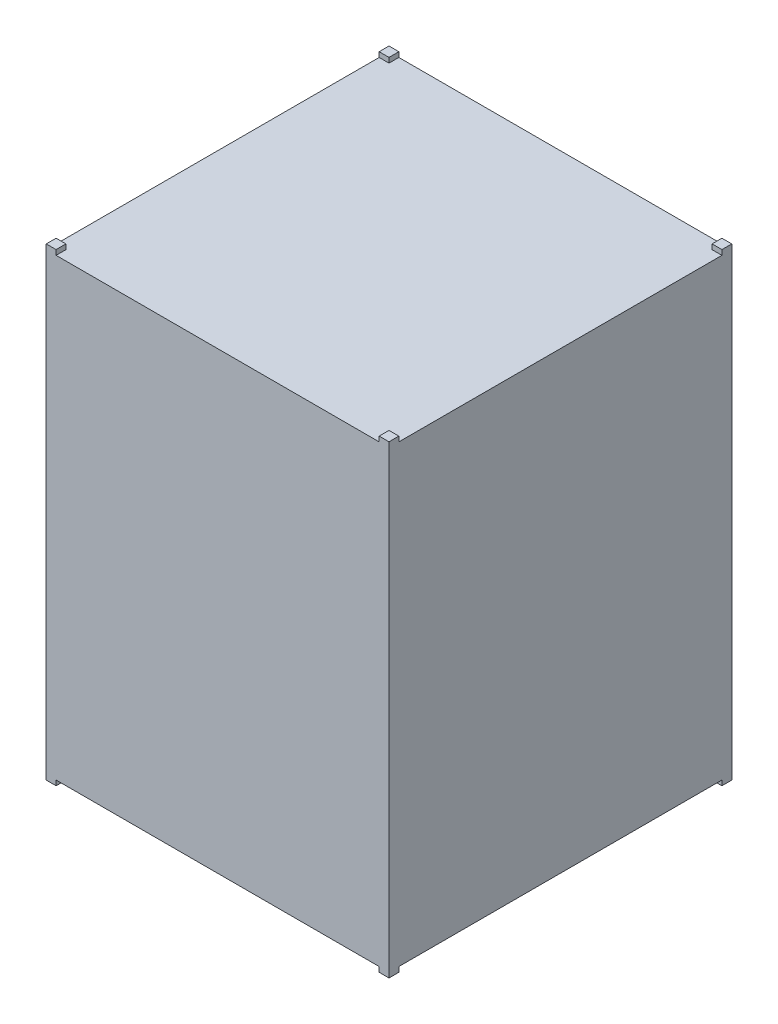
ISO-10303-21;
HEADER;
FILE_DESCRIPTION(('STEP AP214'),'2;1');
FILE_NAME('part.step','',(''),(''),'','','');
FILE_SCHEMA(('AUTOMOTIVE_DESIGN { 1 0 10303 214 1 1 1 1 }'));
ENDSEC;
DATA;
#1=APPLICATION_CONTEXT('core data for automotive mechanical design processes');
#2=APPLICATION_PROTOCOL_DEFINITION('international standard','automotive_design',2000,#1);
#3=PRODUCT_CONTEXT('',#1,'mechanical');
#4=PRODUCT('Part','Part','',(#3));
#5=PRODUCT_RELATED_PRODUCT_CATEGORY('part','',(#4));
#6=PRODUCT_DEFINITION_FORMATION('','',#4);
#7=PRODUCT_DEFINITION_CONTEXT('part definition',#1,'design');
#8=PRODUCT_DEFINITION('design','',#6,#7);
#9=PRODUCT_DEFINITION_SHAPE('','',#8);
#10=(LENGTH_UNIT() NAMED_UNIT(*) SI_UNIT(.MILLI.,.METRE.));
#11=(NAMED_UNIT(*) PLANE_ANGLE_UNIT() SI_UNIT($,.RADIAN.));
#12=(NAMED_UNIT(*) SI_UNIT($,.STERADIAN.) SOLID_ANGLE_UNIT());
#13=UNCERTAINTY_MEASURE_WITH_UNIT(LENGTH_MEASURE(1.E-05),#10,'distance_accuracy_value','');
#14=(GEOMETRIC_REPRESENTATION_CONTEXT(3) GLOBAL_UNCERTAINTY_ASSIGNED_CONTEXT((#13)) GLOBAL_UNIT_ASSIGNED_CONTEXT((#10,
#11,#12)) REPRESENTATION_CONTEXT('',''));
#15=CARTESIAN_POINT('',(0.,0.,0.));
#16=DIRECTION('',(0.,0.,1.));
#17=DIRECTION('',(1.,0.,0.));
#18=AXIS2_PLACEMENT_3D('',#15,#16,#17);
#19=CARTESIAN_POINT('',(-106.65,-150.,-113.15));
#20=DIRECTION('',(0.,0.,-1.));
#21=DIRECTION('',(-1.,0.,0.));
#22=AXIS2_PLACEMENT_3D('',#19,#20,#21);
#23=PLANE('',#22);
#24=DIRECTION('',(-1.,0.,0.));
#25=VECTOR('',#24,1.);
#26=CARTESIAN_POINT('',(-106.65,-150.,-113.15));
#27=LINE('',#26,#25);
#28=CARTESIAN_POINT('',(106.65,-150.,-113.15));
#29=VERTEX_POINT('',#28);
#30=CARTESIAN_POINT('',(-106.65,-150.,-113.15));
#31=VERTEX_POINT('',#30);
#32=EDGE_CURVE('E11',#29,#31,#27,.T.);
#33=ORIENTED_EDGE('',*,*,#32,.T.);
#34=DIRECTION('',(0.,-1.,0.));
#35=VECTOR('',#34,1.);
#36=CARTESIAN_POINT('',(-106.65,153.3,-113.15));
#37=LINE('',#36,#35);
#38=CARTESIAN_POINT('',(-106.65,-153.3,-113.15));
#39=VERTEX_POINT('',#38);
#40=EDGE_CURVE('E263',#31,#39,#37,.T.);
#41=ORIENTED_EDGE('',*,*,#40,.T.);
#42=DIRECTION('',(1.,0.,0.));
#43=VECTOR('',#42,1.);
#44=CARTESIAN_POINT('',(-106.65,-153.3,-113.15));
#45=LINE('',#44,#43);
#46=CARTESIAN_POINT('',(-113.15,-153.3,-113.15));
#47=VERTEX_POINT('',#46);
#48=EDGE_CURVE('E243',#47,#39,#45,.T.);
#49=ORIENTED_EDGE('',*,*,#48,.F.);
#50=DIRECTION('',(0.,-1.,0.));
#51=VECTOR('',#50,1.);
#52=CARTESIAN_POINT('',(-113.15,153.3,-113.15));
#53=LINE('',#52,#51);
#54=CARTESIAN_POINT('',(-113.15,153.3,-113.15));
#55=VERTEX_POINT('',#54);
#56=EDGE_CURVE('E264',#55,#47,#53,.T.);
#57=ORIENTED_EDGE('',*,*,#56,.F.);
#58=DIRECTION('',(1.,0.,0.));
#59=VECTOR('',#58,1.);
#60=CARTESIAN_POINT('',(-106.65,153.3,-113.15));
#61=LINE('',#60,#59);
#62=CARTESIAN_POINT('',(-106.65,153.3,-113.15));
#63=VERTEX_POINT('',#62);
#64=EDGE_CURVE('E228',#55,#63,#61,.T.);
#65=ORIENTED_EDGE('',*,*,#64,.T.);
#66=CARTESIAN_POINT('',(-106.65,150.,-113.15));
#67=VERTEX_POINT('',#66);
#68=EDGE_CURVE('E259',#63,#67,#37,.T.);
#69=ORIENTED_EDGE('',*,*,#68,.T.);
#70=DIRECTION('',(-1.,0.,0.));
#71=VECTOR('',#70,1.);
#72=CARTESIAN_POINT('',(-106.65,150.,-113.15));
#73=LINE('',#72,#71);
#74=CARTESIAN_POINT('',(106.65,150.,-113.15));
#75=VERTEX_POINT('',#74);
#76=EDGE_CURVE('E405',#75,#67,#73,.T.);
#77=ORIENTED_EDGE('',*,*,#76,.F.);
#78=DIRECTION('',(0.,-1.,0.));
#79=VECTOR('',#78,1.);
#80=CARTESIAN_POINT('',(106.65,153.3,-113.15));
#81=LINE('',#80,#79);
#82=CARTESIAN_POINT('',(106.65,153.3,-113.15));
#83=VERTEX_POINT('',#82);
#84=EDGE_CURVE('E301',#83,#75,#81,.T.);
#85=ORIENTED_EDGE('',*,*,#84,.F.);
#86=DIRECTION('',(1.,0.,0.));
#87=VECTOR('',#86,1.);
#88=CARTESIAN_POINT('',(106.65,153.3,-113.15));
#89=LINE('',#88,#87);
#90=CARTESIAN_POINT('',(113.15,153.3,-113.15));
#91=VERTEX_POINT('',#90);
#92=EDGE_CURVE('E283',#83,#91,#89,.T.);
#93=ORIENTED_EDGE('',*,*,#92,.T.);
#94=DIRECTION('',(0.,-1.,0.));
#95=VECTOR('',#94,1.);
#96=CARTESIAN_POINT('',(113.15,153.3,-113.15));
#97=LINE('',#96,#95);
#98=CARTESIAN_POINT('',(113.15,-153.3,-113.15));
#99=VERTEX_POINT('',#98);
#100=EDGE_CURVE('E299',#91,#99,#97,.T.);
#101=ORIENTED_EDGE('',*,*,#100,.T.);
#102=DIRECTION('',(1.,0.,0.));
#103=VECTOR('',#102,1.);
#104=CARTESIAN_POINT('',(106.65,-153.3,-113.15));
#105=LINE('',#104,#103);
#106=CARTESIAN_POINT('',(106.65,-153.3,-113.15));
#107=VERTEX_POINT('',#106);
#108=EDGE_CURVE('E271',#107,#99,#105,.T.);
#109=ORIENTED_EDGE('',*,*,#108,.F.);
#110=EDGE_CURVE('E291',#29,#107,#81,.T.);
#111=ORIENTED_EDGE('',*,*,#110,.F.);
#112=EDGE_LOOP('',(#33,#41,#49,#57,#65,#69,#77,#85,#93,#101,#109,#111));
#113=FACE_BOUND('',#112,.T.);
#114=ADVANCED_FACE('F33',(#113),#23,.T.);
#115=CARTESIAN_POINT('',(113.15,-150.,-106.65));
#116=DIRECTION('',(1.,0.,0.));
#117=DIRECTION('',(0.,0.,-1.));
#118=AXIS2_PLACEMENT_3D('',#115,#116,#117);
#119=PLANE('',#118);
#120=DIRECTION('',(0.,0.,-1.));
#121=VECTOR('',#120,1.);
#122=CARTESIAN_POINT('',(113.15,-150.,-106.65));
#123=LINE('',#122,#121);
#124=CARTESIAN_POINT('',(113.15,-150.,106.65));
#125=VERTEX_POINT('',#124);
#126=CARTESIAN_POINT('',(113.15,-150.,-106.65));
#127=VERTEX_POINT('',#126);
#128=EDGE_CURVE('E425',#125,#127,#123,.T.);
#129=ORIENTED_EDGE('',*,*,#128,.T.);
#130=DIRECTION('',(0.,-1.,0.));
#131=VECTOR('',#130,1.);
#132=CARTESIAN_POINT('',(113.15,153.3,-106.65));
#133=LINE('',#132,#131);
#134=CARTESIAN_POINT('',(113.15,-153.3,-106.65));
#135=VERTEX_POINT('',#134);
#136=EDGE_CURVE('E298',#127,#135,#133,.T.);
#137=ORIENTED_EDGE('',*,*,#136,.T.);
#138=DIRECTION('',(0.,0.,1.));
#139=VECTOR('',#138,1.);
#140=CARTESIAN_POINT('',(113.15,-153.3,-106.65));
#141=LINE('',#140,#139);
#142=EDGE_CURVE('E274',#99,#135,#141,.T.);
#143=ORIENTED_EDGE('',*,*,#142,.F.);
#144=ORIENTED_EDGE('',*,*,#100,.F.);
#145=DIRECTION('',(0.,0.,1.));
#146=VECTOR('',#145,1.);
#147=CARTESIAN_POINT('',(113.15,153.3,-106.65));
#148=LINE('',#147,#146);
#149=CARTESIAN_POINT('',(113.15,153.3,-106.65));
#150=VERTEX_POINT('',#149);
#151=EDGE_CURVE('E286',#91,#150,#148,.T.);
#152=ORIENTED_EDGE('',*,*,#151,.T.);
#153=CARTESIAN_POINT('',(113.15,150.,-106.65));
#154=VERTEX_POINT('',#153);
#155=EDGE_CURVE('E295',#150,#154,#133,.T.);
#156=ORIENTED_EDGE('',*,*,#155,.T.);
#157=DIRECTION('',(0.,0.,-1.));
#158=VECTOR('',#157,1.);
#159=CARTESIAN_POINT('',(113.15,150.,-106.65));
#160=LINE('',#159,#158);
#161=CARTESIAN_POINT('',(113.15,150.,106.65));
#162=VERTEX_POINT('',#161);
#163=EDGE_CURVE('E396',#162,#154,#160,.T.);
#164=ORIENTED_EDGE('',*,*,#163,.F.);
#165=DIRECTION('',(0.,-1.,0.));
#166=VECTOR('',#165,1.);
#167=CARTESIAN_POINT('',(113.15,153.3,106.65));
#168=LINE('',#167,#166);
#169=CARTESIAN_POINT('',(113.15,153.3,106.65));
#170=VERTEX_POINT('',#169);
#171=EDGE_CURVE('E56',#170,#162,#168,.T.);
#172=ORIENTED_EDGE('',*,*,#171,.F.);
#173=DIRECTION('',(0.,0.,1.));
#174=VECTOR('',#173,1.);
#175=CARTESIAN_POINT('',(113.15,153.3,113.15));
#176=LINE('',#175,#174);
#177=CARTESIAN_POINT('',(113.15,153.3,113.15));
#178=VERTEX_POINT('',#177);
#179=EDGE_CURVE('E319',#170,#178,#176,.T.);
#180=ORIENTED_EDGE('',*,*,#179,.T.);
#181=DIRECTION('',(0.,-1.,0.));
#182=VECTOR('',#181,1.);
#183=CARTESIAN_POINT('',(113.15,153.3,113.15));
#184=LINE('',#183,#182);
#185=CARTESIAN_POINT('',(113.15,-153.3,113.15));
#186=VERTEX_POINT('',#185);
#187=EDGE_CURVE('E331',#178,#186,#184,.T.);
#188=ORIENTED_EDGE('',*,*,#187,.T.);
#189=DIRECTION('',(0.,0.,1.));
#190=VECTOR('',#189,1.);
#191=CARTESIAN_POINT('',(113.15,-153.3,113.15));
#192=LINE('',#191,#190);
#193=CARTESIAN_POINT('',(113.15,-153.3,106.65));
#194=VERTEX_POINT('',#193);
#195=EDGE_CURVE('E308',#194,#186,#192,.T.);
#196=ORIENTED_EDGE('',*,*,#195,.F.);
#197=EDGE_CURVE('E334',#125,#194,#168,.T.);
#198=ORIENTED_EDGE('',*,*,#197,.F.);
#199=EDGE_LOOP('',(#129,#137,#143,#144,#152,#156,#164,#172,#180,#188,#196,#198));
#200=FACE_BOUND('',#199,.T.);
#201=ADVANCED_FACE('F465',(#200),#119,.T.);
#202=CARTESIAN_POINT('',(106.65,-150.,113.15));
#203=DIRECTION('',(0.,0.,1.));
#204=DIRECTION('',(1.,0.,0.));
#205=AXIS2_PLACEMENT_3D('',#202,#203,#204);
#206=PLANE('',#205);
#207=DIRECTION('',(1.,0.,0.));
#208=VECTOR('',#207,1.);
#209=CARTESIAN_POINT('',(106.65,-150.,113.15));
#210=LINE('',#209,#208);
#211=CARTESIAN_POINT('',(-106.65,-150.,113.15));
#212=VERTEX_POINT('',#211);
#213=CARTESIAN_POINT('',(106.65,-150.,113.15));
#214=VERTEX_POINT('',#213);
#215=EDGE_CURVE('E418',#212,#214,#210,.T.);
#216=ORIENTED_EDGE('',*,*,#215,.T.);
#217=DIRECTION('',(0.,-1.,0.));
#218=VECTOR('',#217,1.);
#219=CARTESIAN_POINT('',(106.65,153.3,113.15));
#220=LINE('',#219,#218);
#221=CARTESIAN_POINT('',(106.65,-153.3,113.15));
#222=VERTEX_POINT('',#221);
#223=EDGE_CURVE('E330',#214,#222,#220,.T.);
#224=ORIENTED_EDGE('',*,*,#223,.T.);
#225=DIRECTION('',(-1.,0.,0.));
#226=VECTOR('',#225,1.);
#227=CARTESIAN_POINT('',(106.65,-153.3,113.15));
#228=LINE('',#227,#226);
#229=EDGE_CURVE('E311',#186,#222,#228,.T.);
#230=ORIENTED_EDGE('',*,*,#229,.F.);
#231=ORIENTED_EDGE('',*,*,#187,.F.);
#232=DIRECTION('',(-1.,0.,0.));
#233=VECTOR('',#232,1.);
#234=CARTESIAN_POINT('',(106.65,153.3,113.15));
#235=LINE('',#234,#233);
#236=CARTESIAN_POINT('',(106.65,153.3,113.15));
#237=VERTEX_POINT('',#236);
#238=EDGE_CURVE('E322',#178,#237,#235,.T.);
#239=ORIENTED_EDGE('',*,*,#238,.T.);
#240=CARTESIAN_POINT('',(106.65,150.,113.15));
#241=VERTEX_POINT('',#240);
#242=EDGE_CURVE('E326',#237,#241,#220,.T.);
#243=ORIENTED_EDGE('',*,*,#242,.T.);
#244=DIRECTION('',(1.,0.,0.));
#245=VECTOR('',#244,1.);
#246=CARTESIAN_POINT('',(106.65,150.,113.15));
#247=LINE('',#246,#245);
#248=CARTESIAN_POINT('',(-106.65,150.,113.15));
#249=VERTEX_POINT('',#248);
#250=EDGE_CURVE('E388',#249,#241,#247,.T.);
#251=ORIENTED_EDGE('',*,*,#250,.F.);
#252=DIRECTION('',(0.,-1.,0.));
#253=VECTOR('',#252,1.);
#254=CARTESIAN_POINT('',(-106.65,153.3,113.15));
#255=LINE('',#254,#253);
#256=CARTESIAN_POINT('',(-106.65,153.3,113.15));
#257=VERTEX_POINT('',#256);
#258=EDGE_CURVE('E372',#257,#249,#255,.T.);
#259=ORIENTED_EDGE('',*,*,#258,.F.);
#260=DIRECTION('',(-1.,0.,0.));
#261=VECTOR('',#260,1.);
#262=CARTESIAN_POINT('',(-106.65,153.3,113.15));
#263=LINE('',#262,#261);
#264=CARTESIAN_POINT('',(-113.15,153.3,113.15));
#265=VERTEX_POINT('',#264);
#266=EDGE_CURVE('E352',#257,#265,#263,.T.);
#267=ORIENTED_EDGE('',*,*,#266,.T.);
#268=DIRECTION('',(0.,-1.,0.));
#269=VECTOR('',#268,1.);
#270=CARTESIAN_POINT('',(-113.15,153.3,113.15));
#271=LINE('',#270,#269);
#272=CARTESIAN_POINT('',(-113.15,-153.3,113.15));
#273=VERTEX_POINT('',#272);
#274=EDGE_CURVE('E370',#265,#273,#271,.T.);
#275=ORIENTED_EDGE('',*,*,#274,.T.);
#276=DIRECTION('',(-1.,0.,0.));
#277=VECTOR('',#276,1.);
#278=CARTESIAN_POINT('',(-106.65,-153.3,113.15));
#279=LINE('',#278,#277);
#280=CARTESIAN_POINT('',(-106.65,-153.3,113.15));
#281=VERTEX_POINT('',#280);
#282=EDGE_CURVE('E340',#281,#273,#279,.T.);
#283=ORIENTED_EDGE('',*,*,#282,.F.);
#284=EDGE_CURVE('E361',#212,#281,#255,.T.);
#285=ORIENTED_EDGE('',*,*,#284,.F.);
#286=EDGE_LOOP('',(#216,#224,#230,#231,#239,#243,#251,#259,#267,#275,#283,#285));
#287=FACE_BOUND('',#286,.T.);
#288=ADVANCED_FACE('F492',(#287),#206,.T.);
#289=CARTESIAN_POINT('',(-113.15,-150.,-106.65));
#290=DIRECTION('',(-1.,0.,0.));
#291=DIRECTION('',(0.,0.,1.));
#292=AXIS2_PLACEMENT_3D('',#289,#290,#291);
#293=PLANE('',#292);
#294=DIRECTION('',(0.,0.,1.));
#295=VECTOR('',#294,1.);
#296=CARTESIAN_POINT('',(-113.15,-150.,-106.65));
#297=LINE('',#296,#295);
#298=CARTESIAN_POINT('',(-113.15,-150.,-106.65));
#299=VERTEX_POINT('',#298);
#300=CARTESIAN_POINT('',(-113.15,-150.,106.65));
#301=VERTEX_POINT('',#300);
#302=EDGE_CURVE('E411',#299,#301,#297,.T.);
#303=ORIENTED_EDGE('',*,*,#302,.T.);
#304=DIRECTION('',(0.,-1.,0.));
#305=VECTOR('',#304,1.);
#306=CARTESIAN_POINT('',(-113.15,153.3,106.65));
#307=LINE('',#306,#305);
#308=CARTESIAN_POINT('',(-113.15,-153.3,106.65));
#309=VERTEX_POINT('',#308);
#310=EDGE_CURVE('E369',#301,#309,#307,.T.);
#311=ORIENTED_EDGE('',*,*,#310,.T.);
#312=DIRECTION('',(0.,0.,-1.));
#313=VECTOR('',#312,1.);
#314=CARTESIAN_POINT('',(-113.15,-153.3,113.15));
#315=LINE('',#314,#313);
#316=EDGE_CURVE('E343',#273,#309,#315,.T.);
#317=ORIENTED_EDGE('',*,*,#316,.F.);
#318=ORIENTED_EDGE('',*,*,#274,.F.);
#319=DIRECTION('',(0.,0.,-1.));
#320=VECTOR('',#319,1.);
#321=CARTESIAN_POINT('',(-113.15,153.3,113.15));
#322=LINE('',#321,#320);
#323=CARTESIAN_POINT('',(-113.15,153.3,106.65));
#324=VERTEX_POINT('',#323);
#325=EDGE_CURVE('E355',#265,#324,#322,.T.);
#326=ORIENTED_EDGE('',*,*,#325,.T.);
#327=CARTESIAN_POINT('',(-113.15,150.,106.65));
#328=VERTEX_POINT('',#327);
#329=EDGE_CURVE('E366',#324,#328,#307,.T.);
#330=ORIENTED_EDGE('',*,*,#329,.T.);
#331=DIRECTION('',(0.,0.,1.));
#332=VECTOR('',#331,1.);
#333=CARTESIAN_POINT('',(-113.15,150.,-106.65));
#334=LINE('',#333,#332);
#335=CARTESIAN_POINT('',(-113.15,150.,-106.65));
#336=VERTEX_POINT('',#335);
#337=EDGE_CURVE('E379',#336,#328,#334,.T.);
#338=ORIENTED_EDGE('',*,*,#337,.F.);
#339=DIRECTION('',(0.,-1.,0.));
#340=VECTOR('',#339,1.);
#341=CARTESIAN_POINT('',(-113.15,153.3,-106.65));
#342=LINE('',#341,#340);
#343=CARTESIAN_POINT('',(-113.15,153.3,-106.65));
#344=VERTEX_POINT('',#343);
#345=EDGE_CURVE('E266',#344,#336,#342,.T.);
#346=ORIENTED_EDGE('',*,*,#345,.F.);
#347=DIRECTION('',(0.,0.,-1.));
#348=VECTOR('',#347,1.);
#349=CARTESIAN_POINT('',(-113.15,153.3,-106.65));
#350=LINE('',#349,#348);
#351=EDGE_CURVE('E254',#344,#55,#350,.T.);
#352=ORIENTED_EDGE('',*,*,#351,.T.);
#353=ORIENTED_EDGE('',*,*,#56,.T.);
#354=DIRECTION('',(0.,0.,-1.));
#355=VECTOR('',#354,1.);
#356=CARTESIAN_POINT('',(-113.15,-153.3,-106.65));
#357=LINE('',#356,#355);
#358=CARTESIAN_POINT('',(-113.15,-153.3,-106.65));
#359=VERTEX_POINT('',#358);
#360=EDGE_CURVE('E238',#359,#47,#357,.T.);
#361=ORIENTED_EDGE('',*,*,#360,.F.);
#362=EDGE_CURVE('E234',#299,#359,#342,.T.);
#363=ORIENTED_EDGE('',*,*,#362,.F.);
#364=EDGE_LOOP('',(#303,#311,#317,#318,#326,#330,#338,#346,#352,#353,#361,#363));
#365=FACE_BOUND('',#364,.T.);
#366=ADVANCED_FACE('F35',(#365),#293,.T.);
#367=CARTESIAN_POINT('',(0.,-150.,0.));
#368=DIRECTION('',(0.,1.,0.));
#369=DIRECTION('',(0.,0.,1.));
#370=AXIS2_PLACEMENT_3D('',#367,#368,#369);
#371=PLANE('',#370);
#372=DIRECTION('',(0.,0.,1.));
#373=VECTOR('',#372,1.);
#374=CARTESIAN_POINT('',(-106.65,-150.,-113.15));
#375=LINE('',#374,#373);
#376=CARTESIAN_POINT('',(-106.65,-150.,-106.65));
#377=VERTEX_POINT('',#376);
#378=EDGE_CURVE('E224',#31,#377,#375,.T.);
#379=ORIENTED_EDGE('',*,*,#378,.F.);
#380=ORIENTED_EDGE('',*,*,#32,.F.);
#381=DIRECTION('',(0.,0.,-1.));
#382=VECTOR('',#381,1.);
#383=CARTESIAN_POINT('',(106.65,-150.,-113.15));
#384=LINE('',#383,#382);
#385=CARTESIAN_POINT('',(106.65,-150.,-106.65));
#386=VERTEX_POINT('',#385);
#387=EDGE_CURVE('E41',#386,#29,#384,.T.);
#388=ORIENTED_EDGE('',*,*,#387,.F.);
#389=DIRECTION('',(-1.,0.,0.));
#390=VECTOR('',#389,1.);
#391=CARTESIAN_POINT('',(106.65,-150.,-106.65));
#392=LINE('',#391,#390);
#393=EDGE_CURVE('E428',#127,#386,#392,.T.);
#394=ORIENTED_EDGE('',*,*,#393,.F.);
#395=ORIENTED_EDGE('',*,*,#128,.F.);
#396=DIRECTION('',(1.,0.,0.));
#397=VECTOR('',#396,1.);
#398=CARTESIAN_POINT('',(113.15,-150.,106.65));
#399=LINE('',#398,#397);
#400=CARTESIAN_POINT('',(106.65,-150.,106.65));
#401=VERTEX_POINT('',#400);
#402=EDGE_CURVE('E423',#401,#125,#399,.T.);
#403=ORIENTED_EDGE('',*,*,#402,.F.);
#404=DIRECTION('',(0.,0.,-1.));
#405=VECTOR('',#404,1.);
#406=CARTESIAN_POINT('',(106.65,-150.,113.15));
#407=LINE('',#406,#405);
#408=EDGE_CURVE('E421',#214,#401,#407,.T.);
#409=ORIENTED_EDGE('',*,*,#408,.F.);
#410=ORIENTED_EDGE('',*,*,#215,.F.);
#411=DIRECTION('',(0.,0.,1.));
#412=VECTOR('',#411,1.);
#413=CARTESIAN_POINT('',(-106.65,-150.,113.15));
#414=LINE('',#413,#412);
#415=CARTESIAN_POINT('',(-106.65,-150.,106.65));
#416=VERTEX_POINT('',#415);
#417=EDGE_CURVE('E416',#416,#212,#414,.T.);
#418=ORIENTED_EDGE('',*,*,#417,.F.);
#419=DIRECTION('',(1.,0.,0.));
#420=VECTOR('',#419,1.);
#421=CARTESIAN_POINT('',(-113.15,-150.,106.65));
#422=LINE('',#421,#420);
#423=EDGE_CURVE('E414',#301,#416,#422,.T.);
#424=ORIENTED_EDGE('',*,*,#423,.F.);
#425=ORIENTED_EDGE('',*,*,#302,.F.);
#426=DIRECTION('',(-1.,0.,0.));
#427=VECTOR('',#426,1.);
#428=CARTESIAN_POINT('',(-113.15,-150.,-106.65));
#429=LINE('',#428,#427);
#430=EDGE_CURVE('E409',#377,#299,#429,.T.);
#431=ORIENTED_EDGE('',*,*,#430,.F.);
#432=EDGE_LOOP('',(#379,#380,#388,#394,#395,#403,#409,#410,#418,#424,#425,#431));
#433=FACE_BOUND('',#432,.T.);
#434=ADVANCED_FACE('F440',(#433),#371,.F.);
#435=CARTESIAN_POINT('',(0.,150.,0.));
#436=DIRECTION('',(0.,1.,0.));
#437=DIRECTION('',(0.,0.,1.));
#438=AXIS2_PLACEMENT_3D('',#435,#436,#437);
#439=PLANE('',#438);
#440=DIRECTION('',(0.,0.,1.));
#441=VECTOR('',#440,1.);
#442=CARTESIAN_POINT('',(-106.65,150.,-113.15));
#443=LINE('',#442,#441);
#444=CARTESIAN_POINT('',(-106.65,150.,-106.65));
#445=VERTEX_POINT('',#444);
#446=EDGE_CURVE('E364',#67,#445,#443,.T.);
#447=ORIENTED_EDGE('',*,*,#446,.T.);
#448=DIRECTION('',(-1.,0.,0.));
#449=VECTOR('',#448,1.);
#450=CARTESIAN_POINT('',(-113.15,150.,-106.65));
#451=LINE('',#450,#449);
#452=EDGE_CURVE('E376',#445,#336,#451,.T.);
#453=ORIENTED_EDGE('',*,*,#452,.T.);
#454=ORIENTED_EDGE('',*,*,#337,.T.);
#455=DIRECTION('',(1.,0.,0.));
#456=VECTOR('',#455,1.);
#457=CARTESIAN_POINT('',(-113.15,150.,106.65));
#458=LINE('',#457,#456);
#459=CARTESIAN_POINT('',(-106.65,150.,106.65));
#460=VERTEX_POINT('',#459);
#461=EDGE_CURVE('E382',#328,#460,#458,.T.);
#462=ORIENTED_EDGE('',*,*,#461,.T.);
#463=DIRECTION('',(0.,0.,1.));
#464=VECTOR('',#463,1.);
#465=CARTESIAN_POINT('',(-106.65,150.,113.15));
#466=LINE('',#465,#464);
#467=EDGE_CURVE('E385',#460,#249,#466,.T.);
#468=ORIENTED_EDGE('',*,*,#467,.T.);
#469=ORIENTED_EDGE('',*,*,#250,.T.);
#470=DIRECTION('',(0.,0.,-1.));
#471=VECTOR('',#470,1.);
#472=CARTESIAN_POINT('',(106.65,150.,113.15));
#473=LINE('',#472,#471);
#474=CARTESIAN_POINT('',(106.65,150.,106.65));
#475=VERTEX_POINT('',#474);
#476=EDGE_CURVE('E391',#241,#475,#473,.T.);
#477=ORIENTED_EDGE('',*,*,#476,.T.);
#478=DIRECTION('',(1.,0.,0.));
#479=VECTOR('',#478,1.);
#480=CARTESIAN_POINT('',(113.15,150.,106.65));
#481=LINE('',#480,#479);
#482=EDGE_CURVE('E394',#475,#162,#481,.T.);
#483=ORIENTED_EDGE('',*,*,#482,.T.);
#484=ORIENTED_EDGE('',*,*,#163,.T.);
#485=DIRECTION('',(-1.,0.,0.));
#486=VECTOR('',#485,1.);
#487=CARTESIAN_POINT('',(106.65,150.,-106.65));
#488=LINE('',#487,#486);
#489=CARTESIAN_POINT('',(106.65,150.,-106.65));
#490=VERTEX_POINT('',#489);
#491=EDGE_CURVE('E399',#154,#490,#488,.T.);
#492=ORIENTED_EDGE('',*,*,#491,.T.);
#493=DIRECTION('',(0.,0.,-1.));
#494=VECTOR('',#493,1.);
#495=CARTESIAN_POINT('',(106.65,150.,-113.15));
#496=LINE('',#495,#494);
#497=EDGE_CURVE('E402',#490,#75,#496,.T.);
#498=ORIENTED_EDGE('',*,*,#497,.T.);
#499=ORIENTED_EDGE('',*,*,#76,.T.);
#500=EDGE_LOOP('',(#447,#453,#454,#462,#468,#469,#477,#483,#484,#492,#498,#499));
#501=FACE_BOUND('',#500,.T.);
#502=ADVANCED_FACE('F455',(#501),#439,.T.);
#503=CARTESIAN_POINT('',(-106.65,153.3,113.15));
#504=DIRECTION('',(1.,0.,0.));
#505=DIRECTION('',(0.,0.,-1.));
#506=AXIS2_PLACEMENT_3D('',#503,#504,#505);
#507=PLANE('',#506);
#508=ORIENTED_EDGE('',*,*,#417,.T.);
#509=ORIENTED_EDGE('',*,*,#284,.T.);
#510=DIRECTION('',(0.,0.,1.));
#511=VECTOR('',#510,1.);
#512=CARTESIAN_POINT('',(-106.65,-153.3,113.15));
#513=LINE('',#512,#511);
#514=CARTESIAN_POINT('',(-106.65,-153.3,106.65));
#515=VERTEX_POINT('',#514);
#516=EDGE_CURVE('E329',#515,#281,#513,.T.);
#517=ORIENTED_EDGE('',*,*,#516,.F.);
#518=DIRECTION('',(0.,-1.,0.));
#519=VECTOR('',#518,1.);
#520=CARTESIAN_POINT('',(-106.65,153.3,106.65));
#521=LINE('',#520,#519);
#522=EDGE_CURVE('E365',#416,#515,#521,.T.);
#523=ORIENTED_EDGE('',*,*,#522,.F.);
#524=EDGE_LOOP('',(#508,#509,#517,#523));
#525=FACE_BOUND('',#524,.T.);
#526=ADVANCED_FACE('F496',(#525),#507,.T.);
#527=CARTESIAN_POINT('',(-106.65,153.3,106.65));
#528=DIRECTION('',(0.,0.,-1.));
#529=DIRECTION('',(-1.,0.,0.));
#530=AXIS2_PLACEMENT_3D('',#527,#528,#529);
#531=PLANE('',#530);
#532=ORIENTED_EDGE('',*,*,#423,.T.);
#533=ORIENTED_EDGE('',*,*,#522,.T.);
#534=DIRECTION('',(1.,0.,0.));
#535=VECTOR('',#534,1.);
#536=CARTESIAN_POINT('',(-106.65,-153.3,106.65));
#537=LINE('',#536,#535);
#538=EDGE_CURVE('E346',#309,#515,#537,.T.);
#539=ORIENTED_EDGE('',*,*,#538,.F.);
#540=ORIENTED_EDGE('',*,*,#310,.F.);
#541=EDGE_LOOP('',(#532,#533,#539,#540));
#542=FACE_BOUND('',#541,.T.);
#543=ADVANCED_FACE('F499',(#542),#531,.T.);
#544=ORIENTED_EDGE('',*,*,#258,.T.);
#545=ORIENTED_EDGE('',*,*,#467,.F.);
#546=CARTESIAN_POINT('',(-106.65,153.3,106.65));
#547=VERTEX_POINT('',#546);
#548=EDGE_CURVE('E362',#547,#460,#521,.T.);
#549=ORIENTED_EDGE('',*,*,#548,.F.);
#550=DIRECTION('',(0.,0.,1.));
#551=VECTOR('',#550,1.);
#552=CARTESIAN_POINT('',(-106.65,153.3,113.15));
#553=LINE('',#552,#551);
#554=EDGE_CURVE('E349',#547,#257,#553,.T.);
#555=ORIENTED_EDGE('',*,*,#554,.T.);
#556=EDGE_LOOP('',(#544,#545,#549,#555));
#557=FACE_BOUND('',#556,.T.);
#558=ADVANCED_FACE('F538',(#557),#507,.T.);
#559=ORIENTED_EDGE('',*,*,#548,.T.);
#560=ORIENTED_EDGE('',*,*,#461,.F.);
#561=ORIENTED_EDGE('',*,*,#329,.F.);
#562=DIRECTION('',(1.,0.,0.));
#563=VECTOR('',#562,1.);
#564=CARTESIAN_POINT('',(-106.65,153.3,106.65));
#565=LINE('',#564,#563);
#566=EDGE_CURVE('E358',#324,#547,#565,.T.);
#567=ORIENTED_EDGE('',*,*,#566,.T.);
#568=EDGE_LOOP('',(#559,#560,#561,#567));
#569=FACE_BOUND('',#568,.T.);
#570=ADVANCED_FACE('F513',(#569),#531,.T.);
#571=CARTESIAN_POINT('',(0.,153.3,0.));
#572=DIRECTION('',(0.,1.,0.));
#573=DIRECTION('',(0.,0.,1.));
#574=AXIS2_PLACEMENT_3D('',#571,#572,#573);
#575=PLANE('',#574);
#576=ORIENTED_EDGE('',*,*,#554,.F.);
#577=ORIENTED_EDGE('',*,*,#566,.F.);
#578=ORIENTED_EDGE('',*,*,#325,.F.);
#579=ORIENTED_EDGE('',*,*,#266,.F.);
#580=EDGE_LOOP('',(#576,#577,#578,#579));
#581=FACE_BOUND('',#580,.T.);
#582=ADVANCED_FACE('F505',(#581),#575,.T.);
#583=CARTESIAN_POINT('',(0.,-153.3,0.));
#584=DIRECTION('',(0.,1.,0.));
#585=DIRECTION('',(0.,0.,1.));
#586=AXIS2_PLACEMENT_3D('',#583,#584,#585);
#587=PLANE('',#586);
#588=ORIENTED_EDGE('',*,*,#516,.T.);
#589=ORIENTED_EDGE('',*,*,#282,.T.);
#590=ORIENTED_EDGE('',*,*,#316,.T.);
#591=ORIENTED_EDGE('',*,*,#538,.T.);
#592=EDGE_LOOP('',(#588,#589,#590,#591));
#593=FACE_BOUND('',#592,.T.);
#594=ADVANCED_FACE('F503',(#593),#587,.F.);
#595=CARTESIAN_POINT('',(106.65,153.3,113.15));
#596=DIRECTION('',(-1.,0.,0.));
#597=DIRECTION('',(0.,0.,1.));
#598=AXIS2_PLACEMENT_3D('',#595,#596,#597);
#599=PLANE('',#598);
#600=ORIENTED_EDGE('',*,*,#408,.T.);
#601=DIRECTION('',(0.,-1.,0.));
#602=VECTOR('',#601,1.);
#603=CARTESIAN_POINT('',(106.65,153.3,106.65));
#604=LINE('',#603,#602);
#605=CARTESIAN_POINT('',(106.65,-153.3,106.65));
#606=VERTEX_POINT('',#605);
#607=EDGE_CURVE('E325',#401,#606,#604,.T.);
#608=ORIENTED_EDGE('',*,*,#607,.T.);
#609=DIRECTION('',(0.,0.,-1.));
#610=VECTOR('',#609,1.);
#611=CARTESIAN_POINT('',(106.65,-153.3,113.15));
#612=LINE('',#611,#610);
#613=EDGE_CURVE('E293',#222,#606,#612,.T.);
#614=ORIENTED_EDGE('',*,*,#613,.F.);
#615=ORIENTED_EDGE('',*,*,#223,.F.);
#616=EDGE_LOOP('',(#600,#608,#614,#615));
#617=FACE_BOUND('',#616,.T.);
#618=ADVANCED_FACE('F486',(#617),#599,.T.);
#619=CARTESIAN_POINT('',(106.65,153.3,106.65));
#620=DIRECTION('',(0.,0.,-1.));
#621=DIRECTION('',(-1.,0.,0.));
#622=AXIS2_PLACEMENT_3D('',#619,#620,#621);
#623=PLANE('',#622);
#624=ORIENTED_EDGE('',*,*,#402,.T.);
#625=ORIENTED_EDGE('',*,*,#197,.T.);
#626=DIRECTION('',(1.,0.,0.));
#627=VECTOR('',#626,1.);
#628=CARTESIAN_POINT('',(106.65,-153.3,106.65));
#629=LINE('',#628,#627);
#630=EDGE_CURVE('E305',#606,#194,#629,.T.);
#631=ORIENTED_EDGE('',*,*,#630,.F.);
#632=ORIENTED_EDGE('',*,*,#607,.F.);
#633=EDGE_LOOP('',(#624,#625,#631,#632));
#634=FACE_BOUND('',#633,.T.);
#635=ADVANCED_FACE('F479',(#634),#623,.T.);
#636=CARTESIAN_POINT('',(106.65,153.3,106.65));
#637=VERTEX_POINT('',#636);
#638=EDGE_CURVE('E335',#637,#475,#604,.T.);
#639=ORIENTED_EDGE('',*,*,#638,.T.);
#640=ORIENTED_EDGE('',*,*,#476,.F.);
#641=ORIENTED_EDGE('',*,*,#242,.F.);
#642=DIRECTION('',(0.,0.,-1.));
#643=VECTOR('',#642,1.);
#644=CARTESIAN_POINT('',(106.65,153.3,113.15));
#645=LINE('',#644,#643);
#646=EDGE_CURVE('E314',#237,#637,#645,.T.);
#647=ORIENTED_EDGE('',*,*,#646,.T.);
#648=EDGE_LOOP('',(#639,#640,#641,#647));
#649=FACE_BOUND('',#648,.T.);
#650=ADVANCED_FACE('F512',(#649),#599,.T.);
#651=ORIENTED_EDGE('',*,*,#171,.T.);
#652=ORIENTED_EDGE('',*,*,#482,.F.);
#653=ORIENTED_EDGE('',*,*,#638,.F.);
#654=DIRECTION('',(1.,0.,0.));
#655=VECTOR('',#654,1.);
#656=CARTESIAN_POINT('',(106.65,153.3,106.65));
#657=LINE('',#656,#655);
#658=EDGE_CURVE('E317',#637,#170,#657,.T.);
#659=ORIENTED_EDGE('',*,*,#658,.T.);
#660=EDGE_LOOP('',(#651,#652,#653,#659));
#661=FACE_BOUND('',#660,.T.);
#662=ADVANCED_FACE('F585',(#661),#623,.T.);
#663=CARTESIAN_POINT('',(0.,153.3,0.));
#664=DIRECTION('',(0.,-1.,0.));
#665=DIRECTION('',(0.,0.,-1.));
#666=AXIS2_PLACEMENT_3D('',#663,#664,#665);
#667=PLANE('',#666);
#668=ORIENTED_EDGE('',*,*,#646,.F.);
#669=ORIENTED_EDGE('',*,*,#238,.F.);
#670=ORIENTED_EDGE('',*,*,#179,.F.);
#671=ORIENTED_EDGE('',*,*,#658,.F.);
#672=EDGE_LOOP('',(#668,#669,#670,#671));
#673=FACE_BOUND('',#672,.T.);
#674=ADVANCED_FACE('F601',(#673),#667,.F.);
#675=CARTESIAN_POINT('',(0.,-153.3,0.));
#676=DIRECTION('',(0.,-1.,0.));
#677=DIRECTION('',(0.,0.,-1.));
#678=AXIS2_PLACEMENT_3D('',#675,#676,#677);
#679=PLANE('',#678);
#680=ORIENTED_EDGE('',*,*,#613,.T.);
#681=ORIENTED_EDGE('',*,*,#630,.T.);
#682=ORIENTED_EDGE('',*,*,#195,.T.);
#683=ORIENTED_EDGE('',*,*,#229,.T.);
#684=EDGE_LOOP('',(#680,#681,#682,#683));
#685=FACE_BOUND('',#684,.T.);
#686=ADVANCED_FACE('F482',(#685),#679,.T.);
#687=CARTESIAN_POINT('',(106.65,153.3,-106.65));
#688=DIRECTION('',(-1.,0.,0.));
#689=DIRECTION('',(0.,0.,1.));
#690=AXIS2_PLACEMENT_3D('',#687,#688,#689);
#691=PLANE('',#690);
#692=ORIENTED_EDGE('',*,*,#387,.T.);
#693=ORIENTED_EDGE('',*,*,#110,.T.);
#694=DIRECTION('',(0.,0.,-1.));
#695=VECTOR('',#694,1.);
#696=CARTESIAN_POINT('',(106.65,-153.3,-106.65));
#697=LINE('',#696,#695);
#698=CARTESIAN_POINT('',(106.65,-153.3,-106.65));
#699=VERTEX_POINT('',#698);
#700=EDGE_CURVE('E262',#699,#107,#697,.T.);
#701=ORIENTED_EDGE('',*,*,#700,.F.);
#702=DIRECTION('',(0.,-1.,0.));
#703=VECTOR('',#702,1.);
#704=CARTESIAN_POINT('',(106.65,153.3,-106.65));
#705=LINE('',#704,#703);
#706=EDGE_CURVE('E294',#386,#699,#705,.T.);
#707=ORIENTED_EDGE('',*,*,#706,.F.);
#708=EDGE_LOOP('',(#692,#693,#701,#707));
#709=FACE_BOUND('',#708,.T.);
#710=ADVANCED_FACE('F433',(#709),#691,.T.);
#711=CARTESIAN_POINT('',(106.65,153.3,-106.65));
#712=DIRECTION('',(0.,0.,1.));
#713=DIRECTION('',(1.,0.,0.));
#714=AXIS2_PLACEMENT_3D('',#711,#712,#713);
#715=PLANE('',#714);
#716=ORIENTED_EDGE('',*,*,#393,.T.);
#717=ORIENTED_EDGE('',*,*,#706,.T.);
#718=DIRECTION('',(-1.,0.,0.));
#719=VECTOR('',#718,1.);
#720=CARTESIAN_POINT('',(106.65,-153.3,-106.65));
#721=LINE('',#720,#719);
#722=EDGE_CURVE('E277',#135,#699,#721,.T.);
#723=ORIENTED_EDGE('',*,*,#722,.F.);
#724=ORIENTED_EDGE('',*,*,#136,.F.);
#725=EDGE_LOOP('',(#716,#717,#723,#724));
#726=FACE_BOUND('',#725,.T.);
#727=ADVANCED_FACE('F472',(#726),#715,.T.);
#728=ORIENTED_EDGE('',*,*,#84,.T.);
#729=ORIENTED_EDGE('',*,*,#497,.F.);
#730=CARTESIAN_POINT('',(106.65,153.3,-106.65));
#731=VERTEX_POINT('',#730);
#732=EDGE_CURVE('E48',#731,#490,#705,.T.);
#733=ORIENTED_EDGE('',*,*,#732,.F.);
#734=DIRECTION('',(0.,0.,-1.));
#735=VECTOR('',#734,1.);
#736=CARTESIAN_POINT('',(106.65,153.3,-106.65));
#737=LINE('',#736,#735);
#738=EDGE_CURVE('E280',#731,#83,#737,.T.);
#739=ORIENTED_EDGE('',*,*,#738,.T.);
#740=EDGE_LOOP('',(#728,#729,#733,#739));
#741=FACE_BOUND('',#740,.T.);
#742=ADVANCED_FACE('F457',(#741),#691,.T.);
#743=ORIENTED_EDGE('',*,*,#732,.T.);
#744=ORIENTED_EDGE('',*,*,#491,.F.);
#745=ORIENTED_EDGE('',*,*,#155,.F.);
#746=DIRECTION('',(-1.,0.,0.));
#747=VECTOR('',#746,1.);
#748=CARTESIAN_POINT('',(106.65,153.3,-106.65));
#749=LINE('',#748,#747);
#750=EDGE_CURVE('E289',#150,#731,#749,.T.);
#751=ORIENTED_EDGE('',*,*,#750,.T.);
#752=EDGE_LOOP('',(#743,#744,#745,#751));
#753=FACE_BOUND('',#752,.T.);
#754=ADVANCED_FACE('F635',(#753),#715,.T.);
#755=CARTESIAN_POINT('',(0.,153.3,0.));
#756=DIRECTION('',(0.,-1.,0.));
#757=DIRECTION('',(0.,0.,-1.));
#758=AXIS2_PLACEMENT_3D('',#755,#756,#757);
#759=PLANE('',#758);
#760=ORIENTED_EDGE('',*,*,#738,.F.);
#761=ORIENTED_EDGE('',*,*,#750,.F.);
#762=ORIENTED_EDGE('',*,*,#151,.F.);
#763=ORIENTED_EDGE('',*,*,#92,.F.);
#764=EDGE_LOOP('',(#760,#761,#762,#763));
#765=FACE_BOUND('',#764,.T.);
#766=ADVANCED_FACE('F462',(#765),#759,.F.);
#767=CARTESIAN_POINT('',(0.,-153.3,0.));
#768=DIRECTION('',(0.,-1.,0.));
#769=DIRECTION('',(0.,0.,-1.));
#770=AXIS2_PLACEMENT_3D('',#767,#768,#769);
#771=PLANE('',#770);
#772=ORIENTED_EDGE('',*,*,#700,.T.);
#773=ORIENTED_EDGE('',*,*,#108,.T.);
#774=ORIENTED_EDGE('',*,*,#142,.T.);
#775=ORIENTED_EDGE('',*,*,#722,.T.);
#776=EDGE_LOOP('',(#772,#773,#774,#775));
#777=FACE_BOUND('',#776,.T.);
#778=ADVANCED_FACE('F469',(#777),#771,.T.);
#779=CARTESIAN_POINT('',(-106.65,153.3,-106.65));
#780=DIRECTION('',(1.,0.,0.));
#781=DIRECTION('',(0.,0.,-1.));
#782=AXIS2_PLACEMENT_3D('',#779,#780,#781);
#783=PLANE('',#782);
#784=ORIENTED_EDGE('',*,*,#378,.T.);
#785=DIRECTION('',(0.,-1.,0.));
#786=VECTOR('',#785,1.);
#787=CARTESIAN_POINT('',(-106.65,153.3,-106.65));
#788=LINE('',#787,#786);
#789=CARTESIAN_POINT('',(-106.65,-153.3,-106.65));
#790=VERTEX_POINT('',#789);
#791=EDGE_CURVE('E218',#377,#790,#788,.T.);
#792=ORIENTED_EDGE('',*,*,#791,.T.);
#793=DIRECTION('',(0.,0.,1.));
#794=VECTOR('',#793,1.);
#795=CARTESIAN_POINT('',(-106.65,-153.3,-106.65));
#796=LINE('',#795,#794);
#797=EDGE_CURVE('E222',#39,#790,#796,.T.);
#798=ORIENTED_EDGE('',*,*,#797,.F.);
#799=ORIENTED_EDGE('',*,*,#40,.F.);
#800=EDGE_LOOP('',(#784,#792,#798,#799));
#801=FACE_BOUND('',#800,.T.);
#802=ADVANCED_FACE('F220',(#801),#783,.T.);
#803=CARTESIAN_POINT('',(-106.65,153.3,-106.65));
#804=DIRECTION('',(0.,0.,1.));
#805=DIRECTION('',(1.,0.,0.));
#806=AXIS2_PLACEMENT_3D('',#803,#804,#805);
#807=PLANE('',#806);
#808=ORIENTED_EDGE('',*,*,#430,.T.);
#809=ORIENTED_EDGE('',*,*,#362,.T.);
#810=DIRECTION('',(-1.,0.,0.));
#811=VECTOR('',#810,1.);
#812=CARTESIAN_POINT('',(-106.65,-153.3,-106.65));
#813=LINE('',#812,#811);
#814=EDGE_CURVE('E231',#790,#359,#813,.T.);
#815=ORIENTED_EDGE('',*,*,#814,.F.);
#816=ORIENTED_EDGE('',*,*,#791,.F.);
#817=EDGE_LOOP('',(#808,#809,#815,#816));
#818=FACE_BOUND('',#817,.T.);
#819=ADVANCED_FACE('F232',(#818),#807,.T.);
#820=CARTESIAN_POINT('',(-106.65,153.3,-106.65));
#821=VERTEX_POINT('',#820);
#822=EDGE_CURVE('E227',#821,#445,#788,.T.);
#823=ORIENTED_EDGE('',*,*,#822,.T.);
#824=ORIENTED_EDGE('',*,*,#446,.F.);
#825=ORIENTED_EDGE('',*,*,#68,.F.);
#826=DIRECTION('',(0.,0.,1.));
#827=VECTOR('',#826,1.);
#828=CARTESIAN_POINT('',(-106.65,153.3,-106.65));
#829=LINE('',#828,#827);
#830=EDGE_CURVE('E248',#63,#821,#829,.T.);
#831=ORIENTED_EDGE('',*,*,#830,.T.);
#832=EDGE_LOOP('',(#823,#824,#825,#831));
#833=FACE_BOUND('',#832,.T.);
#834=ADVANCED_FACE('F452',(#833),#783,.T.);
#835=ORIENTED_EDGE('',*,*,#345,.T.);
#836=ORIENTED_EDGE('',*,*,#452,.F.);
#837=ORIENTED_EDGE('',*,*,#822,.F.);
#838=DIRECTION('',(-1.,0.,0.));
#839=VECTOR('',#838,1.);
#840=CARTESIAN_POINT('',(-106.65,153.3,-106.65));
#841=LINE('',#840,#839);
#842=EDGE_CURVE('E251',#821,#344,#841,.T.);
#843=ORIENTED_EDGE('',*,*,#842,.T.);
#844=EDGE_LOOP('',(#835,#836,#837,#843));
#845=FACE_BOUND('',#844,.T.);
#846=ADVANCED_FACE('F682',(#845),#807,.T.);
#847=CARTESIAN_POINT('',(0.,153.3,0.));
#848=DIRECTION('',(0.,1.,0.));
#849=DIRECTION('',(0.,0.,1.));
#850=AXIS2_PLACEMENT_3D('',#847,#848,#849);
#851=PLANE('',#850);
#852=ORIENTED_EDGE('',*,*,#830,.F.);
#853=ORIENTED_EDGE('',*,*,#64,.F.);
#854=ORIENTED_EDGE('',*,*,#351,.F.);
#855=ORIENTED_EDGE('',*,*,#842,.F.);
#856=EDGE_LOOP('',(#852,#853,#854,#855));
#857=FACE_BOUND('',#856,.T.);
#858=ADVANCED_FACE('F450',(#857),#851,.T.);
#859=CARTESIAN_POINT('',(0.,-153.3,0.));
#860=DIRECTION('',(0.,1.,0.));
#861=DIRECTION('',(0.,0.,1.));
#862=AXIS2_PLACEMENT_3D('',#859,#860,#861);
#863=PLANE('',#862);
#864=ORIENTED_EDGE('',*,*,#797,.T.);
#865=ORIENTED_EDGE('',*,*,#814,.T.);
#866=ORIENTED_EDGE('',*,*,#360,.T.);
#867=ORIENTED_EDGE('',*,*,#48,.T.);
#868=EDGE_LOOP('',(#864,#865,#866,#867));
#869=FACE_BOUND('',#868,.T.);
#870=ADVANCED_FACE('F241',(#869),#863,.F.);
#871=CLOSED_SHELL('',(#114,#201,#288,#366,#434,#502,#526,#543,#558,#570,#582,#594,#618,#635,
#650,#662,#674,#686,#710,#727,#742,#754,#766,#778,#802,#819,#834,#846,#858,#870));
#872=MANIFOLD_SOLID_BREP('B2',#871);
#873=ADVANCED_BREP_SHAPE_REPRESENTATION('',(#18,#872),#14);
#874=SHAPE_DEFINITION_REPRESENTATION(#9,#873);
ENDSEC;
END-ISO-10303-21;
